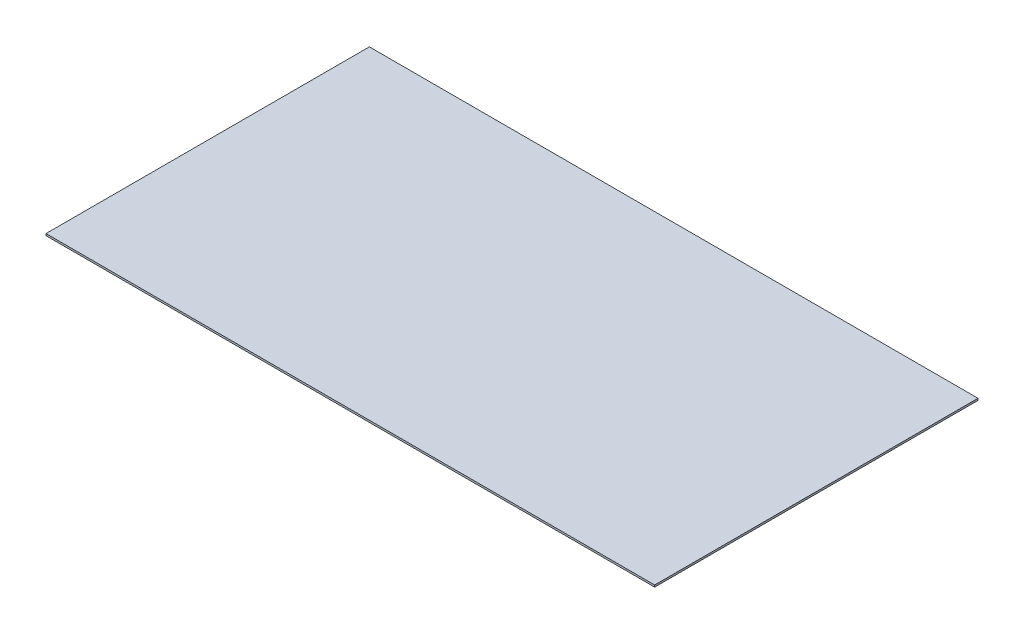
ISO-10303-21;
HEADER;
FILE_DESCRIPTION(('STEP AP214'),'2;1');
FILE_NAME('part.step','',(''),(''),'','','');
FILE_SCHEMA(('AUTOMOTIVE_DESIGN { 1 0 10303 214 1 1 1 1 }'));
ENDSEC;
DATA;
#1=APPLICATION_CONTEXT('core data for automotive mechanical design processes');
#2=APPLICATION_PROTOCOL_DEFINITION('international standard','automotive_design',2000,#1);
#3=PRODUCT_CONTEXT('',#1,'mechanical');
#4=PRODUCT('Part','Part','',(#3));
#5=PRODUCT_RELATED_PRODUCT_CATEGORY('part','',(#4));
#6=PRODUCT_DEFINITION_FORMATION('','',#4);
#7=PRODUCT_DEFINITION_CONTEXT('part definition',#1,'design');
#8=PRODUCT_DEFINITION('design','',#6,#7);
#9=PRODUCT_DEFINITION_SHAPE('','',#8);
#10=(LENGTH_UNIT() NAMED_UNIT(*) SI_UNIT(.MILLI.,.METRE.));
#11=(NAMED_UNIT(*) PLANE_ANGLE_UNIT() SI_UNIT($,.RADIAN.));
#12=(NAMED_UNIT(*) SI_UNIT($,.STERADIAN.) SOLID_ANGLE_UNIT());
#13=UNCERTAINTY_MEASURE_WITH_UNIT(LENGTH_MEASURE(1.E-05),#10,'distance_accuracy_value','');
#14=(GEOMETRIC_REPRESENTATION_CONTEXT(3) GLOBAL_UNCERTAINTY_ASSIGNED_CONTEXT((#13)) GLOBAL_UNIT_ASSIGNED_CONTEXT((#10,
#11,#12)) REPRESENTATION_CONTEXT('',''));
#15=CARTESIAN_POINT('',(0.,0.,0.));
#16=DIRECTION('',(0.,0.,1.));
#17=DIRECTION('',(1.,0.,0.));
#18=AXIS2_PLACEMENT_3D('',#15,#16,#17);
#19=CARTESIAN_POINT('',(812.8,2.54,0.));
#20=DIRECTION('',(-1.,0.,0.));
#21=DIRECTION('',(0.,0.,1.));
#22=AXIS2_PLACEMENT_3D('',#19,#20,#21);
#23=PLANE('',#22);
#24=DIRECTION('',(0.,0.,-1.));
#25=VECTOR('',#24,1.);
#26=CARTESIAN_POINT('',(812.8,0.,0.));
#27=LINE('',#26,#25);
#28=CARTESIAN_POINT('',(812.8,0.,0.));
#29=VERTEX_POINT('',#28);
#30=CARTESIAN_POINT('',(812.8,0.,-431.8));
#31=VERTEX_POINT('',#30);
#32=EDGE_CURVE('E114',#29,#31,#27,.T.);
#33=ORIENTED_EDGE('',*,*,#32,.T.);
#34=DIRECTION('',(0.,-1.,0.));
#35=VECTOR('',#34,1.);
#36=CARTESIAN_POINT('',(812.8,2.54,-431.8));
#37=LINE('',#36,#35);
#38=CARTESIAN_POINT('',(812.8,2.54,-431.8));
#39=VERTEX_POINT('',#38);
#40=EDGE_CURVE('E11',#39,#31,#37,.T.);
#41=ORIENTED_EDGE('',*,*,#40,.F.);
#42=DIRECTION('',(0.,0.,-1.));
#43=VECTOR('',#42,1.);
#44=CARTESIAN_POINT('',(812.8,2.54,0.));
#45=LINE('',#44,#43);
#46=CARTESIAN_POINT('',(812.8,2.54,0.));
#47=VERTEX_POINT('',#46);
#48=EDGE_CURVE('E87',#47,#39,#45,.T.);
#49=ORIENTED_EDGE('',*,*,#48,.F.);
#50=DIRECTION('',(0.,-1.,0.));
#51=VECTOR('',#50,1.);
#52=CARTESIAN_POINT('',(812.8,2.54,0.));
#53=LINE('',#52,#51);
#54=EDGE_CURVE('E110',#47,#29,#53,.T.);
#55=ORIENTED_EDGE('',*,*,#54,.T.);
#56=EDGE_LOOP('',(#33,#41,#49,#55));
#57=FACE_BOUND('',#56,.T.);
#58=ADVANCED_FACE('F47',(#57),#23,.F.);
#59=CARTESIAN_POINT('',(0.,2.54,-431.8));
#60=DIRECTION('',(0.,0.,-1.));
#61=DIRECTION('',(-1.,0.,0.));
#62=AXIS2_PLACEMENT_3D('',#59,#60,#61);
#63=PLANE('',#62);
#64=DIRECTION('',(1.,0.,0.));
#65=VECTOR('',#64,1.);
#66=CARTESIAN_POINT('',(0.,0.,-431.8));
#67=LINE('',#66,#65);
#68=CARTESIAN_POINT('',(0.,0.,-431.8));
#69=VERTEX_POINT('',#68);
#70=EDGE_CURVE('E96',#69,#31,#67,.T.);
#71=ORIENTED_EDGE('',*,*,#70,.F.);
#72=DIRECTION('',(0.,-1.,0.));
#73=VECTOR('',#72,1.);
#74=CARTESIAN_POINT('',(0.,2.54,-431.8));
#75=LINE('',#74,#73);
#76=CARTESIAN_POINT('',(0.,2.54,-431.8));
#77=VERTEX_POINT('',#76);
#78=EDGE_CURVE('E56',#77,#69,#75,.T.);
#79=ORIENTED_EDGE('',*,*,#78,.F.);
#80=DIRECTION('',(1.,0.,0.));
#81=VECTOR('',#80,1.);
#82=CARTESIAN_POINT('',(0.,2.54,-431.8));
#83=LINE('',#82,#81);
#84=EDGE_CURVE('E94',#77,#39,#83,.T.);
#85=ORIENTED_EDGE('',*,*,#84,.T.);
#86=ORIENTED_EDGE('',*,*,#40,.T.);
#87=EDGE_LOOP('',(#71,#79,#85,#86));
#88=FACE_BOUND('',#87,.T.);
#89=ADVANCED_FACE('F93',(#88),#63,.T.);
#90=CARTESIAN_POINT('',(0.,2.54,0.));
#91=DIRECTION('',(-1.,0.,0.));
#92=DIRECTION('',(0.,0.,1.));
#93=AXIS2_PLACEMENT_3D('',#90,#91,#92);
#94=PLANE('',#93);
#95=DIRECTION('',(0.,0.,-1.));
#96=VECTOR('',#95,1.);
#97=CARTESIAN_POINT('',(0.,0.,0.));
#98=LINE('',#97,#96);
#99=CARTESIAN_POINT('',(0.,0.,0.));
#100=VERTEX_POINT('',#99);
#101=EDGE_CURVE('E120',#100,#69,#98,.T.);
#102=ORIENTED_EDGE('',*,*,#101,.F.);
#103=DIRECTION('',(0.,-1.,0.));
#104=VECTOR('',#103,1.);
#105=CARTESIAN_POINT('',(0.,2.54,0.));
#106=LINE('',#105,#104);
#107=CARTESIAN_POINT('',(0.,2.54,0.));
#108=VERTEX_POINT('',#107);
#109=EDGE_CURVE('E79',#108,#100,#106,.T.);
#110=ORIENTED_EDGE('',*,*,#109,.F.);
#111=DIRECTION('',(0.,0.,-1.));
#112=VECTOR('',#111,1.);
#113=CARTESIAN_POINT('',(0.,2.54,0.));
#114=LINE('',#113,#112);
#115=EDGE_CURVE('E103',#108,#77,#114,.T.);
#116=ORIENTED_EDGE('',*,*,#115,.T.);
#117=ORIENTED_EDGE('',*,*,#78,.T.);
#118=EDGE_LOOP('',(#102,#110,#116,#117));
#119=FACE_BOUND('',#118,.T.);
#120=ADVANCED_FACE('F106',(#119),#94,.T.);
#121=CARTESIAN_POINT('',(0.,2.54,0.));
#122=DIRECTION('',(0.,0.,-1.));
#123=DIRECTION('',(-1.,0.,0.));
#124=AXIS2_PLACEMENT_3D('',#121,#122,#123);
#125=PLANE('',#124);
#126=DIRECTION('',(1.,0.,0.));
#127=VECTOR('',#126,1.);
#128=CARTESIAN_POINT('',(0.,0.,0.));
#129=LINE('',#128,#127);
#130=EDGE_CURVE('E82',#100,#29,#129,.T.);
#131=ORIENTED_EDGE('',*,*,#130,.T.);
#132=ORIENTED_EDGE('',*,*,#54,.F.);
#133=DIRECTION('',(1.,0.,0.));
#134=VECTOR('',#133,1.);
#135=CARTESIAN_POINT('',(0.,2.54,0.));
#136=LINE('',#135,#134);
#137=EDGE_CURVE('E64',#108,#47,#136,.T.);
#138=ORIENTED_EDGE('',*,*,#137,.F.);
#139=ORIENTED_EDGE('',*,*,#109,.T.);
#140=EDGE_LOOP('',(#131,#132,#138,#139));
#141=FACE_BOUND('',#140,.T.);
#142=ADVANCED_FACE('F137',(#141),#125,.F.);
#143=CARTESIAN_POINT('',(0.,2.54,0.));
#144=DIRECTION('',(0.,1.,0.));
#145=DIRECTION('',(0.,0.,1.));
#146=AXIS2_PLACEMENT_3D('',#143,#144,#145);
#147=PLANE('',#146);
#148=ORIENTED_EDGE('',*,*,#48,.T.);
#149=ORIENTED_EDGE('',*,*,#84,.F.);
#150=ORIENTED_EDGE('',*,*,#115,.F.);
#151=ORIENTED_EDGE('',*,*,#137,.T.);
#152=EDGE_LOOP('',(#148,#149,#150,#151));
#153=FACE_BOUND('',#152,.T.);
#154=ADVANCED_FACE('F102',(#153),#147,.T.);
#155=CARTESIAN_POINT('',(0.,0.,0.));
#156=DIRECTION('',(0.,1.,0.));
#157=DIRECTION('',(0.,0.,1.));
#158=AXIS2_PLACEMENT_3D('',#155,#156,#157);
#159=PLANE('',#158);
#160=ORIENTED_EDGE('',*,*,#32,.F.);
#161=ORIENTED_EDGE('',*,*,#130,.F.);
#162=ORIENTED_EDGE('',*,*,#101,.T.);
#163=ORIENTED_EDGE('',*,*,#70,.T.);
#164=EDGE_LOOP('',(#160,#161,#162,#163));
#165=FACE_BOUND('',#164,.T.);
#166=ADVANCED_FACE('F131',(#165),#159,.F.);
#167=CLOSED_SHELL('',(#58,#89,#120,#142,#154,#166));
#168=MANIFOLD_SOLID_BREP('B2',#167);
#169=ADVANCED_BREP_SHAPE_REPRESENTATION('',(#18,#168),#14);
#170=SHAPE_DEFINITION_REPRESENTATION(#9,#169);
ENDSEC;
END-ISO-10303-21;
